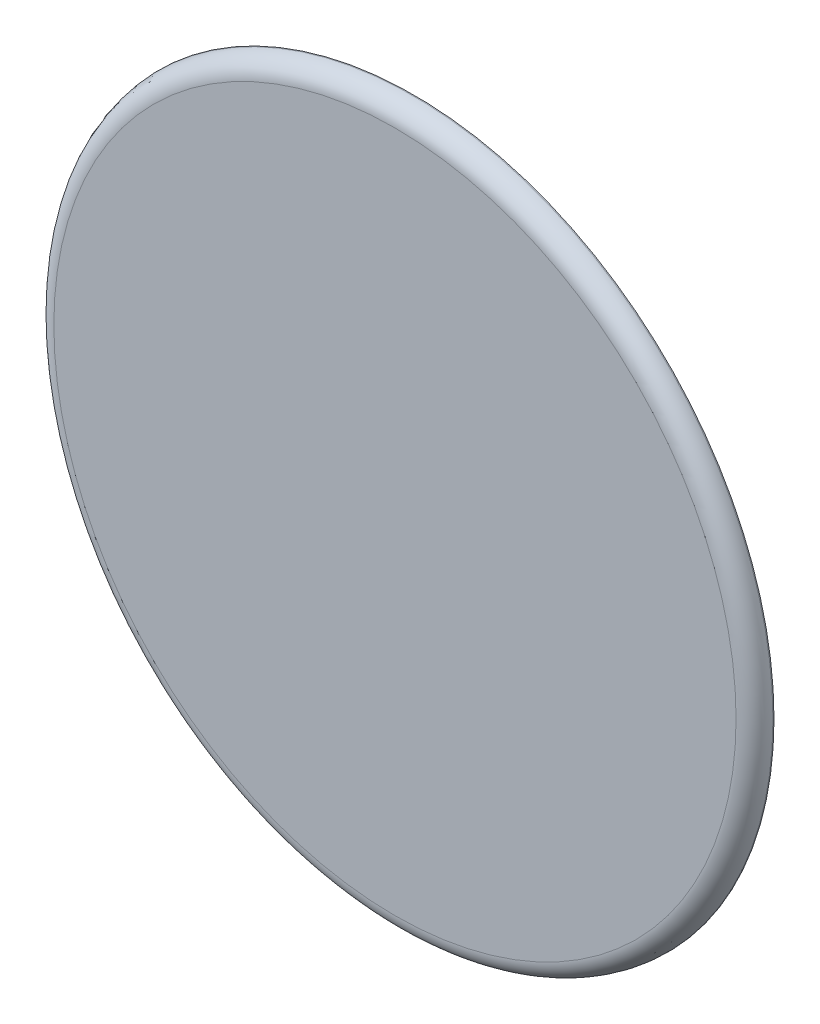
ISO-10303-21;
HEADER;
FILE_DESCRIPTION(('STEP AP214'),'2;1');
FILE_NAME('part.step','',(''),(''),'','','');
FILE_SCHEMA(('AUTOMOTIVE_DESIGN { 1 0 10303 214 1 1 1 1 }'));
ENDSEC;
DATA;
#1=APPLICATION_CONTEXT('core data for automotive mechanical design processes');
#2=APPLICATION_PROTOCOL_DEFINITION('international standard','automotive_design',2000,#1);
#3=PRODUCT_CONTEXT('',#1,'mechanical');
#4=PRODUCT('Part','Part','',(#3));
#5=PRODUCT_RELATED_PRODUCT_CATEGORY('part','',(#4));
#6=PRODUCT_DEFINITION_FORMATION('','',#4);
#7=PRODUCT_DEFINITION_CONTEXT('part definition',#1,'design');
#8=PRODUCT_DEFINITION('design','',#6,#7);
#9=PRODUCT_DEFINITION_SHAPE('','',#8);
#10=(LENGTH_UNIT() NAMED_UNIT(*) SI_UNIT(.MILLI.,.METRE.));
#11=(NAMED_UNIT(*) PLANE_ANGLE_UNIT() SI_UNIT($,.RADIAN.));
#12=(NAMED_UNIT(*) SI_UNIT($,.STERADIAN.) SOLID_ANGLE_UNIT());
#13=UNCERTAINTY_MEASURE_WITH_UNIT(LENGTH_MEASURE(1.E-05),#10,'distance_accuracy_value','');
#14=(GEOMETRIC_REPRESENTATION_CONTEXT(3) GLOBAL_UNCERTAINTY_ASSIGNED_CONTEXT((#13)) GLOBAL_UNIT_ASSIGNED_CONTEXT((#10,
#11,#12)) REPRESENTATION_CONTEXT('',''));
#15=CARTESIAN_POINT('',(0.,0.,0.));
#16=DIRECTION('',(0.,0.,1.));
#17=DIRECTION('',(1.,0.,0.));
#18=AXIS2_PLACEMENT_3D('',#15,#16,#17);
#19=CARTESIAN_POINT('',(0.,0.,0.));
#20=DIRECTION('',(0.,0.,-1.));
#21=DIRECTION('',(1.,0.,0.));
#22=AXIS2_PLACEMENT_3D('',#19,#20,#21);
#23=CONICAL_SURFACE('',#22,190.,0.05235987755983);
#24=CARTESIAN_POINT('',(0.,0.,0.523359562429439));
#25=DIRECTION('',(0.,0.,-1.));
#26=DIRECTION('',(-1.,0.,0.));
#27=AXIS2_PLACEMENT_3D('',#24,#25,#26);
#28=CIRCLE('',#27,189.972571887567);
#29=CARTESIAN_POINT('',(-189.972571887567,0.,0.523359562429439));
#30=VERTEX_POINT('',#29);
#31=EDGE_CURVE('E10',#30,#30,#28,.T.);
#32=ORIENTED_EDGE('',*,*,#31,.T.);
#33=EDGE_LOOP('',(#32));
#34=FACE_BOUND('',#33,.T.);
#35=CARTESIAN_POINT('',(0.,0.,0.));
#36=DIRECTION('',(0.,0.,1.));
#37=DIRECTION('',(1.,0.,0.));
#38=AXIS2_PLACEMENT_3D('',#35,#36,#37);
#39=CIRCLE('',#38,190.);
#40=CARTESIAN_POINT('',(190.,0.,0.));
#41=VERTEX_POINT('',#40);
#42=EDGE_CURVE('E43',#41,#41,#39,.T.);
#43=ORIENTED_EDGE('',*,*,#42,.T.);
#44=EDGE_LOOP('',(#43));
#45=FACE_BOUND('',#44,.T.);
#46=ADVANCED_FACE('F32',(#34,#45),#23,.T.);
#47=CARTESIAN_POINT('',(0.,0.,10.));
#48=DIRECTION('',(0.,0.,1.));
#49=DIRECTION('',(1.,0.,0.));
#50=AXIS2_PLACEMENT_3D('',#47,#48,#49);
#51=PLANE('',#50);
#52=CARTESIAN_POINT('',(0.,0.,10.));
#53=DIRECTION('',(0.,0.,1.));
#54=DIRECTION('',(1.,0.,0.));
#55=AXIS2_PLACEMENT_3D('',#52,#53,#54);
#56=CIRCLE('',#55,179.986276540021);
#57=CARTESIAN_POINT('',(179.986276540021,0.,10.));
#58=VERTEX_POINT('',#57);
#59=EDGE_CURVE('E39',#58,#58,#56,.T.);
#60=ORIENTED_EDGE('',*,*,#59,.T.);
#61=EDGE_LOOP('',(#60));
#62=FACE_BOUND('',#61,.T.);
#63=ADVANCED_FACE('F53',(#62),#51,.T.);
#64=CARTESIAN_POINT('',(0.,0.,0.));
#65=DIRECTION('',(0.,0.,1.));
#66=DIRECTION('',(1.,0.,0.));
#67=AXIS2_PLACEMENT_3D('',#64,#65,#66);
#68=PLANE('',#67);
#69=ORIENTED_EDGE('',*,*,#42,.F.);
#70=EDGE_LOOP('',(#69));
#71=FACE_BOUND('',#70,.T.);
#72=ADVANCED_FACE('F51',(#71),#68,.F.);
#73=CARTESIAN_POINT('',(0.,0.,0.));
#74=DIRECTION('',(0.,0.,1.));
#75=DIRECTION('',(1.,0.,0.));
#76=AXIS2_PLACEMENT_3D('',#73,#74,#75);
#77=TOROIDAL_SURFACE('',#76,179.986276540021,10.);
#78=ORIENTED_EDGE('',*,*,#31,.F.);
#79=EDGE_LOOP('',(#78));
#80=FACE_BOUND('',#79,.T.);
#81=ORIENTED_EDGE('',*,*,#59,.F.);
#82=EDGE_LOOP('',(#81));
#83=FACE_BOUND('',#82,.T.);
#84=ADVANCED_FACE('F34',(#80,#83),#77,.T.);
#85=CLOSED_SHELL('',(#46,#63,#72,#84));
#86=MANIFOLD_SOLID_BREP('B2',#85);
#87=ADVANCED_BREP_SHAPE_REPRESENTATION('',(#18,#86),#14);
#88=SHAPE_DEFINITION_REPRESENTATION(#9,#87);
ENDSEC;
END-ISO-10303-21;
